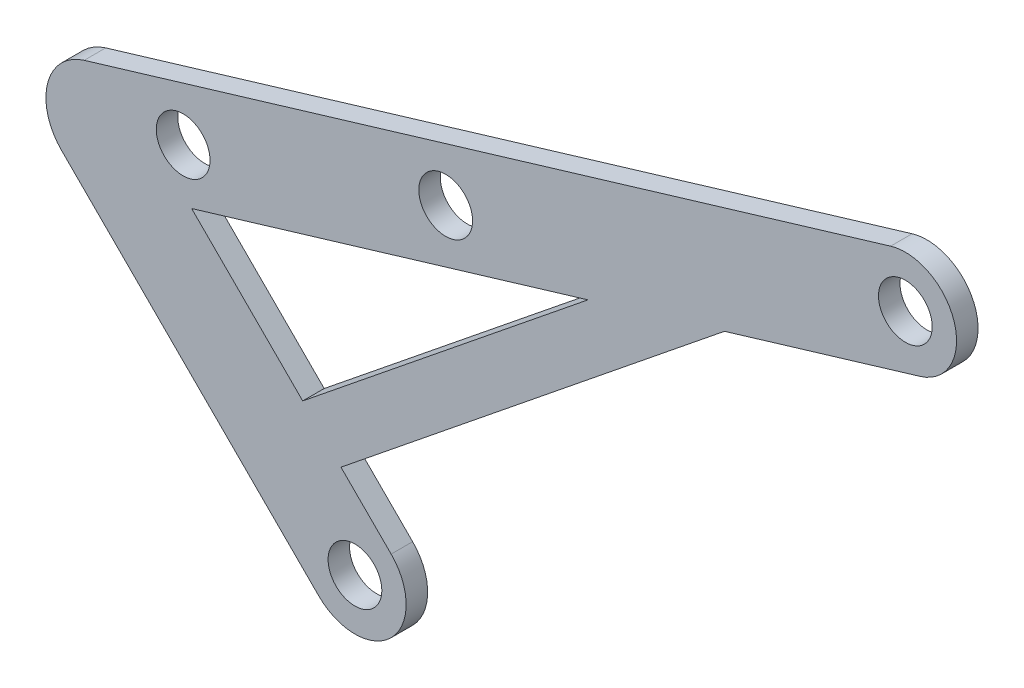
ISO-10303-21;
HEADER;
FILE_DESCRIPTION(('STEP AP214'),'2;1');
FILE_NAME('part.step','',(''),(''),'','','');
FILE_SCHEMA(('AUTOMOTIVE_DESIGN { 1 0 10303 214 1 1 1 1 }'));
ENDSEC;
DATA;
#1=APPLICATION_CONTEXT('core data for automotive mechanical design processes');
#2=APPLICATION_PROTOCOL_DEFINITION('international standard','automotive_design',2000,#1);
#3=PRODUCT_CONTEXT('',#1,'mechanical');
#4=PRODUCT('Part','Part','',(#3));
#5=PRODUCT_RELATED_PRODUCT_CATEGORY('part','',(#4));
#6=PRODUCT_DEFINITION_FORMATION('','',#4);
#7=PRODUCT_DEFINITION_CONTEXT('part definition',#1,'design');
#8=PRODUCT_DEFINITION('design','',#6,#7);
#9=PRODUCT_DEFINITION_SHAPE('','',#8);
#10=(LENGTH_UNIT() NAMED_UNIT(*) SI_UNIT(.MILLI.,.METRE.));
#11=(NAMED_UNIT(*) PLANE_ANGLE_UNIT() SI_UNIT($,.RADIAN.));
#12=(NAMED_UNIT(*) SI_UNIT($,.STERADIAN.) SOLID_ANGLE_UNIT());
#13=UNCERTAINTY_MEASURE_WITH_UNIT(LENGTH_MEASURE(1.E-05),#10,'distance_accuracy_value','');
#14=(GEOMETRIC_REPRESENTATION_CONTEXT(3) GLOBAL_UNCERTAINTY_ASSIGNED_CONTEXT((#13)) GLOBAL_UNIT_ASSIGNED_CONTEXT((#10,
#11,#12)) REPRESENTATION_CONTEXT('',''));
#15=CARTESIAN_POINT('',(0.,0.,0.));
#16=DIRECTION('',(0.,0.,1.));
#17=DIRECTION('',(1.,0.,0.));
#18=AXIS2_PLACEMENT_3D('',#15,#16,#17);
#19=CARTESIAN_POINT('',(17.6996498354391,100.426845998726,4.));
#20=DIRECTION('',(0.,0.,-1.));
#21=DIRECTION('',(-1.,0.,0.));
#22=AXIS2_PLACEMENT_3D('',#19,#20,#21);
#23=CYLINDRICAL_SURFACE('',#22,9.52499999999996);
#24=CARTESIAN_POINT('',(17.6996498354391,100.426845998726,0.));
#25=DIRECTION('',(0.,0.,1.));
#26=DIRECTION('',(1.,0.,0.));
#27=AXIS2_PLACEMENT_3D('',#24,#25,#26);
#28=CIRCLE('',#27,9.52499999999996);
#29=CARTESIAN_POINT('',(14.9591206641496,109.549078448147,0.));
#30=VERTEX_POINT('',#29);
#31=CARTESIAN_POINT('',(20.44017900673,91.3046135493014,0.));
#32=VERTEX_POINT('',#31);
#33=EDGE_CURVE('E191',#30,#32,#28,.F.);
#34=ORIENTED_EDGE('',*,*,#33,.F.);
#35=DIRECTION('',(0.,0.,-1.));
#36=VECTOR('',#35,1.);
#37=CARTESIAN_POINT('',(14.9591206641496,109.549078448147,4.));
#38=LINE('',#37,#36);
#39=CARTESIAN_POINT('',(14.9591206641496,109.549078448147,4.));
#40=VERTEX_POINT('',#39);
#41=EDGE_CURVE('E216',#40,#30,#38,.T.);
#42=ORIENTED_EDGE('',*,*,#41,.F.);
#43=CARTESIAN_POINT('',(17.6996498354391,100.426845998726,4.));
#44=DIRECTION('',(0.,0.,1.));
#45=DIRECTION('',(1.,0.,0.));
#46=AXIS2_PLACEMENT_3D('',#43,#44,#45);
#47=CIRCLE('',#46,9.52499999999996);
#48=CARTESIAN_POINT('',(20.44017900673,91.3046135493014,4.));
#49=VERTEX_POINT('',#48);
#50=EDGE_CURVE('E163',#40,#49,#47,.F.);
#51=ORIENTED_EDGE('',*,*,#50,.T.);
#52=DIRECTION('',(0.,0.,-1.));
#53=VECTOR('',#52,1.);
#54=CARTESIAN_POINT('',(20.44017900673,91.3046135493014,4.));
#55=LINE('',#54,#53);
#56=EDGE_CURVE('E134',#49,#32,#55,.T.);
#57=ORIENTED_EDGE('',*,*,#56,.T.);
#58=EDGE_LOOP('',(#34,#42,#51,#57));
#59=FACE_BOUND('',#58,.T.);
#60=ADVANCED_FACE('F42',(#59),#23,.T.);
#61=CARTESIAN_POINT('',(-28.9482541850627,96.3582896498803,4.));
#62=DIRECTION('',(0.287719598035716,-0.957714692852817,0.));
#63=DIRECTION('',(0.957714692852817,0.287719598035716,0.));
#64=AXIS2_PLACEMENT_3D('',#61,#62,#63);
#65=PLANE('',#64);
#66=DIRECTION('',(-0.957714692852817,-0.287719598035716,0.));
#67=VECTOR('',#66,1.);
#68=CARTESIAN_POINT('',(-28.9482541850627,96.3582896498803,0.));
#69=LINE('',#68,#67);
#70=CARTESIAN_POINT('',(-135.070184848601,64.4768123569558,0.));
#71=VERTEX_POINT('',#70);
#72=EDGE_CURVE('E194',#30,#71,#69,.T.);
#73=ORIENTED_EDGE('',*,*,#72,.T.);
#74=DIRECTION('',(0.,0.,-1.));
#75=VECTOR('',#74,1.);
#76=CARTESIAN_POINT('',(-135.070184848601,64.4768123569558,4.));
#77=LINE('',#76,#75);
#78=CARTESIAN_POINT('',(-135.070184848601,64.4768123569558,4.));
#79=VERTEX_POINT('',#78);
#80=EDGE_CURVE('E50',#71,#79,#77,.F.);
#81=ORIENTED_EDGE('',*,*,#80,.T.);
#82=DIRECTION('',(-0.957714692852817,-0.287719598035716,0.));
#83=VECTOR('',#82,1.);
#84=CARTESIAN_POINT('',(-28.9482541850627,96.3582896498803,4.));
#85=LINE('',#84,#83);
#86=EDGE_CURVE('E166',#40,#79,#85,.T.);
#87=ORIENTED_EDGE('',*,*,#86,.F.);
#88=ORIENTED_EDGE('',*,*,#41,.T.);
#89=EDGE_LOOP('',(#73,#81,#87,#88));
#90=FACE_BOUND('',#89,.T.);
#91=ADVANCED_FACE('F258',(#90),#65,.F.);
#92=CARTESIAN_POINT('',(-45.7177295317741,-45.7177295317737,4.));
#93=DIRECTION('',(0.707106781186551,0.707106781186544,0.));
#94=DIRECTION('',(-0.707106781186544,0.707106781186551,0.));
#95=AXIS2_PLACEMENT_3D('',#92,#93,#94);
#96=PLANE('',#95);
#97=DIRECTION('',(0.707106781186544,-0.707106781186551,0.));
#98=VECTOR('',#97,1.);
#99=CARTESIAN_POINT('',(-45.7177295317741,-45.7177295317737,4.));
#100=LINE('',#99,#98);
#101=CARTESIAN_POINT('',(-139.264056680109,47.8285976165622,4.));
#102=VERTEX_POINT('',#101);
#103=CARTESIAN_POINT('',(-91.4354590635473,0.,4.));
#104=VERTEX_POINT('',#103);
#105=EDGE_CURVE('E168',#102,#104,#100,.T.);
#106=ORIENTED_EDGE('',*,*,#105,.F.);
#107=DIRECTION('',(0.,0.,-1.));
#108=VECTOR('',#107,1.);
#109=CARTESIAN_POINT('',(-139.264056680109,47.8285976165622,4.));
#110=LINE('',#109,#108);
#111=CARTESIAN_POINT('',(-139.264056680109,47.8285976165622,0.));
#112=VERTEX_POINT('',#111);
#113=EDGE_CURVE('E218',#102,#112,#110,.T.);
#114=ORIENTED_EDGE('',*,*,#113,.T.);
#115=DIRECTION('',(0.707106781186544,-0.707106781186551,0.));
#116=VECTOR('',#115,1.);
#117=CARTESIAN_POINT('',(-45.7177295317741,-45.7177295317737,0.));
#118=LINE('',#117,#116);
#119=CARTESIAN_POINT('',(-91.4354590635473,0.,0.));
#120=VERTEX_POINT('',#119);
#121=EDGE_CURVE('E196',#112,#120,#118,.T.);
#122=ORIENTED_EDGE('',*,*,#121,.T.);
#123=DIRECTION('',(0.,0.,-1.));
#124=VECTOR('',#123,1.);
#125=CARTESIAN_POINT('',(-91.4354590635473,0.,4.));
#126=LINE('',#125,#124);
#127=EDGE_CURVE('E213',#104,#120,#126,.T.);
#128=ORIENTED_EDGE('',*,*,#127,.F.);
#129=EDGE_LOOP('',(#106,#114,#122,#128));
#130=FACE_BOUND('',#129,.T.);
#131=ADVANCED_FACE('F226',(#130),#96,.F.);
#132=CARTESIAN_POINT('',(-84.7002669727454,6.73519209080183,4.));
#133=DIRECTION('',(0.,0.,-1.));
#134=DIRECTION('',(-1.,0.,0.));
#135=AXIS2_PLACEMENT_3D('',#132,#133,#134);
#136=CYLINDRICAL_SURFACE('',#135,9.52500000000001);
#137=CARTESIAN_POINT('',(-84.7002669727454,6.73519209080183,0.));
#138=DIRECTION('',(0.,0.,1.));
#139=DIRECTION('',(1.,0.,0.));
#140=AXIS2_PLACEMENT_3D('',#137,#138,#139);
#141=CIRCLE('',#140,9.52500000000001);
#142=CARTESIAN_POINT('',(-77.9650748819435,13.4703841816037,0.));
#143=VERTEX_POINT('',#142);
#144=EDGE_CURVE('E198',#143,#120,#141,.F.);
#145=ORIENTED_EDGE('',*,*,#144,.F.);
#146=DIRECTION('',(0.,0.,-1.));
#147=VECTOR('',#146,1.);
#148=CARTESIAN_POINT('',(-77.9650748819435,13.4703841816037,4.));
#149=LINE('',#148,#147);
#150=CARTESIAN_POINT('',(-77.9650748819435,13.4703841816037,4.));
#151=VERTEX_POINT('',#150);
#152=EDGE_CURVE('E211',#151,#143,#149,.T.);
#153=ORIENTED_EDGE('',*,*,#152,.F.);
#154=CARTESIAN_POINT('',(-84.7002669727454,6.73519209080183,4.));
#155=DIRECTION('',(0.,0.,1.));
#156=DIRECTION('',(1.,0.,0.));
#157=AXIS2_PLACEMENT_3D('',#154,#155,#156);
#158=CIRCLE('',#157,9.52500000000001);
#159=EDGE_CURVE('E170',#151,#104,#158,.F.);
#160=ORIENTED_EDGE('',*,*,#159,.T.);
#161=ORIENTED_EDGE('',*,*,#127,.T.);
#162=EDGE_LOOP('',(#145,#153,#160,#161));
#163=FACE_BOUND('',#162,.T.);
#164=ADVANCED_FACE('F236',(#163),#136,.T.);
#165=CARTESIAN_POINT('',(-32.2473453501699,-32.2473453501699,4.));
#166=DIRECTION('',(-0.707106781186548,-0.707106781186547,0.));
#167=DIRECTION('',(0.707106781186547,-0.707106781186548,0.));
#168=AXIS2_PLACEMENT_3D('',#165,#166,#167);
#169=PLANE('',#168);
#170=DIRECTION('',(-0.707106781186547,0.707106781186548,0.));
#171=VECTOR('',#170,1.);
#172=CARTESIAN_POINT('',(-32.2473453501699,-32.2473453501699,0.));
#173=LINE('',#172,#171);
#174=CARTESIAN_POINT('',(-87.3001936089136,22.8055029085737,0.));
#175=VERTEX_POINT('',#174);
#176=EDGE_CURVE('E185',#143,#175,#173,.T.);
#177=ORIENTED_EDGE('',*,*,#176,.T.);
#178=DIRECTION('',(0.,0.,-1.));
#179=VECTOR('',#178,1.);
#180=CARTESIAN_POINT('',(-87.3001936089136,22.8055029085737,4.));
#181=LINE('',#180,#179);
#182=CARTESIAN_POINT('',(-87.3001936089136,22.8055029085737,4.));
#183=VERTEX_POINT('',#182);
#184=EDGE_CURVE('E208',#183,#175,#181,.T.);
#185=ORIENTED_EDGE('',*,*,#184,.F.);
#186=DIRECTION('',(-0.707106781186547,0.707106781186548,0.));
#187=VECTOR('',#186,1.);
#188=CARTESIAN_POINT('',(-32.2473453501699,-32.2473453501699,4.));
#189=LINE('',#188,#187);
#190=EDGE_CURVE('E145',#151,#183,#189,.T.);
#191=ORIENTED_EDGE('',*,*,#190,.F.);
#192=ORIENTED_EDGE('',*,*,#152,.T.);
#193=EDGE_LOOP('',(#177,#185,#191,#192));
#194=FACE_BOUND('',#193,.T.);
#195=ADVANCED_FACE('F281',(#194),#169,.F.);
#196=CARTESIAN_POINT('',(-45.5657820263689,56.4769551843278,4.));
#197=DIRECTION('',(-0.627918187239032,0.778279352247281,0.));
#198=DIRECTION('',(-0.778279352247281,-0.627918187239032,0.));
#199=AXIS2_PLACEMENT_3D('',#196,#197,#198);
#200=PLANE('',#199);
#201=DIRECTION('',(0.778279352247281,0.627918187239032,0.));
#202=VECTOR('',#201,1.);
#203=CARTESIAN_POINT('',(-45.5657820263689,56.4769551843278,0.));
#204=LINE('',#203,#202);
#205=CARTESIAN_POINT('',(-15.9478194077324,80.3728189811855,0.));
#206=VERTEX_POINT('',#205);
#207=EDGE_CURVE('E201',#175,#206,#204,.T.);
#208=ORIENTED_EDGE('',*,*,#207,.T.);
#209=DIRECTION('',(0.,0.,-1.));
#210=VECTOR('',#209,1.);
#211=CARTESIAN_POINT('',(-15.9478194077324,80.3728189811855,4.));
#212=LINE('',#211,#210);
#213=CARTESIAN_POINT('',(-15.9478194077324,80.3728189811855,4.));
#214=VERTEX_POINT('',#213);
#215=EDGE_CURVE('E205',#214,#206,#212,.T.);
#216=ORIENTED_EDGE('',*,*,#215,.F.);
#217=DIRECTION('',(0.778279352247281,0.627918187239032,0.));
#218=VECTOR('',#217,1.);
#219=CARTESIAN_POINT('',(-45.5657820263689,56.4769551843278,4.));
#220=LINE('',#219,#218);
#221=EDGE_CURVE('E173',#183,#214,#220,.T.);
#222=ORIENTED_EDGE('',*,*,#221,.F.);
#223=ORIENTED_EDGE('',*,*,#184,.T.);
#224=EDGE_LOOP('',(#208,#216,#222,#223));
#225=FACE_BOUND('',#224,.T.);
#226=ADVANCED_FACE('F275',(#225),#200,.F.);
#227=CARTESIAN_POINT('',(-51.8505625670714,64.2666880311199,4.));
#228=DIRECTION('',(-0.627918187239035,0.778279352247279,0.));
#229=DIRECTION('',(-0.778279352247279,-0.627918187239035,0.));
#230=AXIS2_PLACEMENT_3D('',#227,#228,#229);
#231=PLANE('',#230);
#232=DIRECTION('',(0.778279352247279,0.627918187239035,0.));
#233=VECTOR('',#232,1.);
#234=CARTESIAN_POINT('',(-51.8505625670714,64.2666880311199,0.));
#235=LINE('',#234,#233);
#236=CARTESIAN_POINT('',(-94.4179106845314,29.9232199841916,0.));
#237=VERTEX_POINT('',#236);
#238=CARTESIAN_POINT('',(-41.3443851014054,72.7431044875037,0.));
#239=VERTEX_POINT('',#238);
#240=EDGE_CURVE('E131',#237,#239,#235,.T.);
#241=ORIENTED_EDGE('',*,*,#240,.F.);
#242=DIRECTION('',(0.,0.,-1.));
#243=VECTOR('',#242,1.);
#244=CARTESIAN_POINT('',(-94.4179106845314,29.9232199841916,4.));
#245=LINE('',#244,#243);
#246=CARTESIAN_POINT('',(-94.4179106845314,29.9232199841916,4.));
#247=VERTEX_POINT('',#246);
#248=EDGE_CURVE('E125',#247,#237,#245,.T.);
#249=ORIENTED_EDGE('',*,*,#248,.F.);
#250=DIRECTION('',(0.778279352247279,0.627918187239035,0.));
#251=VECTOR('',#250,1.);
#252=CARTESIAN_POINT('',(-51.8505625670714,64.2666880311199,4.));
#253=LINE('',#252,#251);
#254=CARTESIAN_POINT('',(-41.3443851014054,72.7431044875037,4.));
#255=VERTEX_POINT('',#254);
#256=EDGE_CURVE('E129',#247,#255,#253,.T.);
#257=ORIENTED_EDGE('',*,*,#256,.T.);
#258=DIRECTION('',(0.,0.,-1.));
#259=VECTOR('',#258,1.);
#260=CARTESIAN_POINT('',(-41.3443851014054,72.7431044875037,4.));
#261=LINE('',#260,#259);
#262=EDGE_CURVE('E179',#255,#239,#261,.T.);
#263=ORIENTED_EDGE('',*,*,#262,.T.);
#264=EDGE_LOOP('',(#241,#249,#257,#263));
#265=FACE_BOUND('',#264,.T.);
#266=ADVANCED_FACE('F127',(#265),#231,.T.);
#267=CARTESIAN_POINT('',(-115.084548239215,50.5898575388751,0.));
#268=VERTEX_POINT('',#267);
#269=EDGE_CURVE('E181',#237,#268,#173,.T.);
#270=ORIENTED_EDGE('',*,*,#269,.T.);
#271=DIRECTION('',(0.,0.,-1.));
#272=VECTOR('',#271,1.);
#273=CARTESIAN_POINT('',(-115.084548239215,50.5898575388751,4.));
#274=LINE('',#273,#272);
#275=CARTESIAN_POINT('',(-115.084548239215,50.5898575388751,4.));
#276=VERTEX_POINT('',#275);
#277=EDGE_CURVE('E135',#276,#268,#274,.T.);
#278=ORIENTED_EDGE('',*,*,#277,.F.);
#279=EDGE_CURVE('E138',#247,#276,#189,.T.);
#280=ORIENTED_EDGE('',*,*,#279,.F.);
#281=ORIENTED_EDGE('',*,*,#248,.T.);
#282=EDGE_LOOP('',(#270,#278,#280,#281));
#283=FACE_BOUND('',#282,.T.);
#284=ADVANCED_FACE('F139',(#283),#169,.F.);
#285=CARTESIAN_POINT('',(-23.4671958424822,78.1138247510344,4.));
#286=DIRECTION('',(-0.287719598035713,0.957714692852818,0.));
#287=DIRECTION('',(-0.957714692852818,-0.287719598035713,0.));
#288=AXIS2_PLACEMENT_3D('',#285,#286,#287);
#289=PLANE('',#288);
#290=DIRECTION('',(0.957714692852818,0.287719598035713,0.));
#291=VECTOR('',#290,1.);
#292=CARTESIAN_POINT('',(-23.4671958424822,78.1138247510344,0.));
#293=LINE('',#292,#291);
#294=EDGE_CURVE('E152',#206,#32,#293,.T.);
#295=ORIENTED_EDGE('',*,*,#294,.T.);
#296=ORIENTED_EDGE('',*,*,#56,.F.);
#297=DIRECTION('',(0.957714692852818,0.287719598035713,0.));
#298=VECTOR('',#297,1.);
#299=CARTESIAN_POINT('',(-23.4671958424822,78.1138247510344,4.));
#300=LINE('',#299,#298);
#301=EDGE_CURVE('E160',#214,#49,#300,.T.);
#302=ORIENTED_EDGE('',*,*,#301,.F.);
#303=ORIENTED_EDGE('',*,*,#215,.T.);
#304=EDGE_LOOP('',(#295,#296,#302,#303));
#305=FACE_BOUND('',#304,.T.);
#306=ADVANCED_FACE('F272',(#305),#289,.F.);
#307=CARTESIAN_POINT('',(17.6996498354391,100.426845998726,4.));
#308=DIRECTION('',(0.,0.,-1.));
#309=DIRECTION('',(-1.,0.,0.));
#310=AXIS2_PLACEMENT_3D('',#307,#308,#309);
#311=CYLINDRICAL_SURFACE('',#310,5.);
#312=CARTESIAN_POINT('',(17.6996498354391,100.426845998726,4.));
#313=DIRECTION('',(0.,0.,1.));
#314=DIRECTION('',(1.,0.,0.));
#315=AXIS2_PLACEMENT_3D('',#312,#313,#314);
#316=CIRCLE('',#315,5.);
#317=CARTESIAN_POINT('',(22.6996498354391,100.426845998726,4.));
#318=VERTEX_POINT('',#317);
#319=EDGE_CURVE('E159',#318,#318,#316,.T.);
#320=ORIENTED_EDGE('',*,*,#319,.T.);
#321=EDGE_LOOP('',(#320));
#322=FACE_BOUND('',#321,.T.);
#323=CARTESIAN_POINT('',(17.6996498354391,100.426845998726,0.));
#324=DIRECTION('',(0.,0.,1.));
#325=DIRECTION('',(1.,0.,0.));
#326=AXIS2_PLACEMENT_3D('',#323,#324,#325);
#327=CIRCLE('',#326,5.);
#328=CARTESIAN_POINT('',(22.6996498354391,100.426845998726,0.));
#329=VERTEX_POINT('',#328);
#330=EDGE_CURVE('E188',#329,#329,#327,.T.);
#331=ORIENTED_EDGE('',*,*,#330,.F.);
#332=EDGE_LOOP('',(#331));
#333=FACE_BOUND('',#332,.T.);
#334=ADVANCED_FACE('F269',(#322,#333),#311,.F.);
#335=EDGE_CURVE('E184',#268,#239,#293,.T.);
#336=ORIENTED_EDGE('',*,*,#335,.T.);
#337=ORIENTED_EDGE('',*,*,#262,.F.);
#338=EDGE_CURVE('E143',#276,#255,#300,.T.);
#339=ORIENTED_EDGE('',*,*,#338,.F.);
#340=ORIENTED_EDGE('',*,*,#277,.T.);
#341=EDGE_LOOP('',(#336,#337,#339,#340));
#342=FACE_BOUND('',#341,.T.);
#343=ADVANCED_FACE('F271',(#342),#289,.F.);
#344=CARTESIAN_POINT('',(-84.7002669727454,6.73519209080183,4.));
#345=DIRECTION('',(0.,0.,-1.));
#346=DIRECTION('',(-1.,0.,0.));
#347=AXIS2_PLACEMENT_3D('',#344,#345,#346);
#348=CYLINDRICAL_SURFACE('',#347,5.);
#349=CARTESIAN_POINT('',(-84.7002669727454,6.73519209080183,4.));
#350=DIRECTION('',(0.,0.,1.));
#351=DIRECTION('',(1.,0.,0.));
#352=AXIS2_PLACEMENT_3D('',#349,#350,#351);
#353=CIRCLE('',#352,5.);
#354=CARTESIAN_POINT('',(-79.7002669727454,6.73519209080183,4.));
#355=VERTEX_POINT('',#354);
#356=EDGE_CURVE('E176',#355,#355,#353,.T.);
#357=ORIENTED_EDGE('',*,*,#356,.T.);
#358=EDGE_LOOP('',(#357));
#359=FACE_BOUND('',#358,.T.);
#360=CARTESIAN_POINT('',(-84.7002669727454,6.73519209080183,0.));
#361=DIRECTION('',(0.,0.,1.));
#362=DIRECTION('',(1.,0.,0.));
#363=AXIS2_PLACEMENT_3D('',#360,#361,#362);
#364=CIRCLE('',#363,5.);
#365=CARTESIAN_POINT('',(-79.7002669727454,6.73519209080183,0.));
#366=VERTEX_POINT('',#365);
#367=EDGE_CURVE('E149',#366,#366,#364,.T.);
#368=ORIENTED_EDGE('',*,*,#367,.F.);
#369=EDGE_LOOP('',(#368));
#370=FACE_BOUND('',#369,.T.);
#371=ADVANCED_FACE('F303',(#359,#370),#348,.F.);
#372=CARTESIAN_POINT('',(0.,0.,4.));
#373=DIRECTION('',(0.,0.,1.));
#374=DIRECTION('',(1.,0.,0.));
#375=AXIS2_PLACEMENT_3D('',#372,#373,#374);
#376=PLANE('',#375);
#377=CARTESIAN_POINT('',(-116.663330615583,60.0611055389089,4.));
#378=DIRECTION('',(0.,0.,1.));
#379=DIRECTION('',(1.,0.,0.));
#380=AXIS2_PLACEMENT_3D('',#377,#378,#379);
#381=CIRCLE('',#380,5.00000000000001);
#382=CARTESIAN_POINT('',(-111.663330615583,60.0611055389089,4.));
#383=VERTEX_POINT('',#382);
#384=EDGE_CURVE('E393',#383,#383,#381,.T.);
#385=ORIENTED_EDGE('',*,*,#384,.F.);
#386=EDGE_LOOP('',(#385));
#387=FACE_BOUND('',#386,.T.);
#388=CARTESIAN_POINT('',(-67.8198812800894,74.7348050387304,4.));
#389=DIRECTION('',(0.,0.,1.));
#390=DIRECTION('',(1.,0.,0.));
#391=AXIS2_PLACEMENT_3D('',#388,#389,#390);
#392=CIRCLE('',#391,5.00000000000001);
#393=CARTESIAN_POINT('',(-62.8198812800894,74.7348050387304,4.));
#394=VERTEX_POINT('',#393);
#395=EDGE_CURVE('E394',#394,#394,#392,.T.);
#396=ORIENTED_EDGE('',*,*,#395,.F.);
#397=EDGE_LOOP('',(#396));
#398=FACE_BOUND('',#397,.T.);
#399=ORIENTED_EDGE('',*,*,#256,.F.);
#400=ORIENTED_EDGE('',*,*,#279,.T.);
#401=ORIENTED_EDGE('',*,*,#338,.T.);
#402=EDGE_LOOP('',(#399,#400,#401));
#403=FACE_BOUND('',#402,.T.);
#404=ORIENTED_EDGE('',*,*,#319,.F.);
#405=EDGE_LOOP('',(#404));
#406=FACE_BOUND('',#405,.T.);
#407=ORIENTED_EDGE('',*,*,#86,.T.);
#408=CARTESIAN_POINT('',(-132.192988868243,54.8996654284276,4.));
#409=DIRECTION('',(0.,0.,1.));
#410=DIRECTION('',(1.,0.,0.));
#411=AXIS2_PLACEMENT_3D('',#408,#409,#410);
#412=CIRCLE('',#411,10.);
#413=EDGE_CURVE('E11',#79,#102,#412,.T.);
#414=ORIENTED_EDGE('',*,*,#413,.T.);
#415=ORIENTED_EDGE('',*,*,#105,.T.);
#416=ORIENTED_EDGE('',*,*,#159,.F.);
#417=ORIENTED_EDGE('',*,*,#190,.T.);
#418=ORIENTED_EDGE('',*,*,#221,.T.);
#419=ORIENTED_EDGE('',*,*,#301,.T.);
#420=ORIENTED_EDGE('',*,*,#50,.F.);
#421=EDGE_LOOP('',(#407,#414,#415,#416,#417,#418,#419,#420));
#422=FACE_BOUND('',#421,.T.);
#423=ORIENTED_EDGE('',*,*,#356,.F.);
#424=EDGE_LOOP('',(#423));
#425=FACE_BOUND('',#424,.T.);
#426=ADVANCED_FACE('F146',(#387,#398,#403,#406,#422,#425),#376,.T.);
#427=CARTESIAN_POINT('',(0.,0.,0.));
#428=DIRECTION('',(0.,0.,1.));
#429=DIRECTION('',(1.,0.,0.));
#430=AXIS2_PLACEMENT_3D('',#427,#428,#429);
#431=PLANE('',#430);
#432=CARTESIAN_POINT('',(-116.663330615583,60.0611055389089,0.));
#433=DIRECTION('',(0.,0.,1.));
#434=DIRECTION('',(1.,0.,0.));
#435=AXIS2_PLACEMENT_3D('',#432,#433,#434);
#436=CIRCLE('',#435,5.00000000000001);
#437=CARTESIAN_POINT('',(-111.663330615583,60.0611055389089,0.));
#438=VERTEX_POINT('',#437);
#439=EDGE_CURVE('E182',#438,#438,#436,.T.);
#440=ORIENTED_EDGE('',*,*,#439,.T.);
#441=EDGE_LOOP('',(#440));
#442=FACE_BOUND('',#441,.T.);
#443=CARTESIAN_POINT('',(-67.8198812800894,74.7348050387304,0.));
#444=DIRECTION('',(0.,0.,1.));
#445=DIRECTION('',(1.,0.,0.));
#446=AXIS2_PLACEMENT_3D('',#443,#444,#445);
#447=CIRCLE('',#446,5.00000000000001);
#448=CARTESIAN_POINT('',(-62.8198812800894,74.7348050387304,0.));
#449=VERTEX_POINT('',#448);
#450=EDGE_CURVE('E155',#449,#449,#447,.T.);
#451=ORIENTED_EDGE('',*,*,#450,.T.);
#452=EDGE_LOOP('',(#451));
#453=FACE_BOUND('',#452,.T.);
#454=ORIENTED_EDGE('',*,*,#240,.T.);
#455=ORIENTED_EDGE('',*,*,#335,.F.);
#456=ORIENTED_EDGE('',*,*,#269,.F.);
#457=EDGE_LOOP('',(#454,#455,#456));
#458=FACE_BOUND('',#457,.T.);
#459=ORIENTED_EDGE('',*,*,#330,.T.);
#460=EDGE_LOOP('',(#459));
#461=FACE_BOUND('',#460,.T.);
#462=ORIENTED_EDGE('',*,*,#121,.F.);
#463=CARTESIAN_POINT('',(-132.192988868243,54.8996654284276,0.));
#464=DIRECTION('',(0.,0.,1.));
#465=DIRECTION('',(1.,0.,0.));
#466=AXIS2_PLACEMENT_3D('',#463,#464,#465);
#467=CIRCLE('',#466,10.);
#468=EDGE_CURVE('E64',#112,#71,#467,.F.);
#469=ORIENTED_EDGE('',*,*,#468,.T.);
#470=ORIENTED_EDGE('',*,*,#72,.F.);
#471=ORIENTED_EDGE('',*,*,#33,.T.);
#472=ORIENTED_EDGE('',*,*,#294,.F.);
#473=ORIENTED_EDGE('',*,*,#207,.F.);
#474=ORIENTED_EDGE('',*,*,#176,.F.);
#475=ORIENTED_EDGE('',*,*,#144,.T.);
#476=EDGE_LOOP('',(#462,#469,#470,#471,#472,#473,#474,#475));
#477=FACE_BOUND('',#476,.T.);
#478=ORIENTED_EDGE('',*,*,#367,.T.);
#479=EDGE_LOOP('',(#478));
#480=FACE_BOUND('',#479,.T.);
#481=ADVANCED_FACE('F230',(#442,#453,#458,#461,#477,#480),#431,.F.);
#482=CARTESIAN_POINT('',(-132.192988868243,54.8996654284276,4.));
#483=DIRECTION('',(0.,0.,-1.));
#484=DIRECTION('',(-1.,0.,0.));
#485=AXIS2_PLACEMENT_3D('',#482,#483,#484);
#486=CYLINDRICAL_SURFACE('',#485,10.);
#487=ORIENTED_EDGE('',*,*,#413,.F.);
#488=ORIENTED_EDGE('',*,*,#80,.F.);
#489=ORIENTED_EDGE('',*,*,#468,.F.);
#490=ORIENTED_EDGE('',*,*,#113,.F.);
#491=EDGE_LOOP('',(#487,#488,#489,#490));
#492=FACE_BOUND('',#491,.T.);
#493=ADVANCED_FACE('F44',(#492),#486,.T.);
#494=CARTESIAN_POINT('',(-67.8198812800894,74.7348050387304,0.));
#495=DIRECTION('',(0.,0.,1.));
#496=DIRECTION('',(1.,0.,0.));
#497=AXIS2_PLACEMENT_3D('',#494,#495,#496);
#498=CYLINDRICAL_SURFACE('',#497,5.00000000000001);
#499=ORIENTED_EDGE('',*,*,#450,.F.);
#500=EDGE_LOOP('',(#499));
#501=FACE_BOUND('',#500,.T.);
#502=ORIENTED_EDGE('',*,*,#395,.T.);
#503=EDGE_LOOP('',(#502));
#504=FACE_BOUND('',#503,.T.);
#505=ADVANCED_FACE('F245',(#501,#504),#498,.F.);
#506=CARTESIAN_POINT('',(-116.663330615583,60.0611055389089,0.));
#507=DIRECTION('',(0.,0.,1.));
#508=DIRECTION('',(1.,0.,0.));
#509=AXIS2_PLACEMENT_3D('',#506,#507,#508);
#510=CYLINDRICAL_SURFACE('',#509,5.00000000000001);
#511=ORIENTED_EDGE('',*,*,#439,.F.);
#512=EDGE_LOOP('',(#511));
#513=FACE_BOUND('',#512,.T.);
#514=ORIENTED_EDGE('',*,*,#384,.T.);
#515=EDGE_LOOP('',(#514));
#516=FACE_BOUND('',#515,.T.);
#517=ADVANCED_FACE('F251',(#513,#516),#510,.F.);
#518=CLOSED_SHELL('',(#60,#91,#131,#164,#195,#226,#266,#284,#306,#334,#343,#371,#426,#481,#493,
#505,#517));
#519=MANIFOLD_SOLID_BREP('B2',#518);
#520=ADVANCED_BREP_SHAPE_REPRESENTATION('',(#18,#519),#14);
#521=SHAPE_DEFINITION_REPRESENTATION(#9,#520);
ENDSEC;
END-ISO-10303-21;
